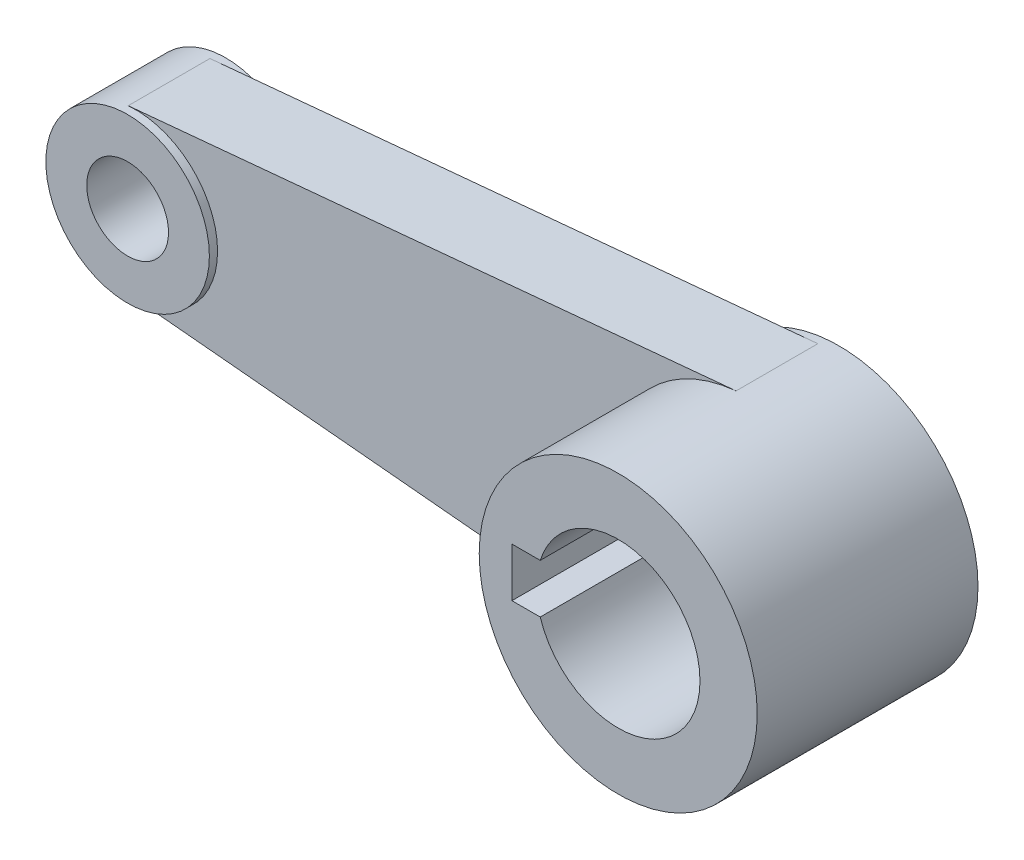
ISO-10303-21;
HEADER;
FILE_DESCRIPTION(('STEP AP214'),'2;1');
FILE_NAME('part.step','',(''),(''),'','','');
FILE_SCHEMA(('AUTOMOTIVE_DESIGN { 1 0 10303 214 1 1 1 1 }'));
ENDSEC;
DATA;
#1=APPLICATION_CONTEXT('core data for automotive mechanical design processes');
#2=APPLICATION_PROTOCOL_DEFINITION('international standard','automotive_design',2000,#1);
#3=PRODUCT_CONTEXT('',#1,'mechanical');
#4=PRODUCT('Part','Part','',(#3));
#5=PRODUCT_RELATED_PRODUCT_CATEGORY('part','',(#4));
#6=PRODUCT_DEFINITION_FORMATION('','',#4);
#7=PRODUCT_DEFINITION_CONTEXT('part definition',#1,'design');
#8=PRODUCT_DEFINITION('design','',#6,#7);
#9=PRODUCT_DEFINITION_SHAPE('','',#8);
#10=(LENGTH_UNIT() NAMED_UNIT(*) SI_UNIT(.MILLI.,.METRE.));
#11=(NAMED_UNIT(*) PLANE_ANGLE_UNIT() SI_UNIT($,.RADIAN.));
#12=(NAMED_UNIT(*) SI_UNIT($,.STERADIAN.) SOLID_ANGLE_UNIT());
#13=UNCERTAINTY_MEASURE_WITH_UNIT(LENGTH_MEASURE(1.E-05),#10,'distance_accuracy_value','');
#14=(GEOMETRIC_REPRESENTATION_CONTEXT(3) GLOBAL_UNCERTAINTY_ASSIGNED_CONTEXT((#13)) GLOBAL_UNIT_ASSIGNED_CONTEXT((#10,
#11,#12)) REPRESENTATION_CONTEXT('',''));
#15=CARTESIAN_POINT('',(0.,0.,0.));
#16=DIRECTION('',(0.,0.,1.));
#17=DIRECTION('',(1.,0.,0.));
#18=AXIS2_PLACEMENT_3D('',#15,#16,#17);
#19=CARTESIAN_POINT('',(-75.,0.,6.));
#20=DIRECTION('',(0.,0.,-1.));
#21=DIRECTION('',(-1.,0.,0.));
#22=AXIS2_PLACEMENT_3D('',#19,#20,#21);
#23=CYLINDRICAL_SURFACE('',#22,9.99999999999999);
#24=DIRECTION('',(0.,0.,-1.));
#25=VECTOR('',#24,1.);
#26=CARTESIAN_POINT('',(-75.9333333333333,-9.95634917471705,5.));
#27=LINE('',#26,#25);
#28=CARTESIAN_POINT('',(-75.9333333333333,-9.95634917471705,5.));
#29=VERTEX_POINT('',#28);
#30=CARTESIAN_POINT('',(-75.9333333333333,-9.95634917471705,-5.));
#31=VERTEX_POINT('',#30);
#32=EDGE_CURVE('E51',#29,#31,#27,.T.);
#33=ORIENTED_EDGE('',*,*,#32,.F.);
#34=CARTESIAN_POINT('',(-75.,0.,5.));
#35=DIRECTION('',(0.,0.,1.));
#36=DIRECTION('',(1.,0.,0.));
#37=AXIS2_PLACEMENT_3D('',#34,#35,#36);
#38=CIRCLE('',#37,9.99999999999999);
#39=CARTESIAN_POINT('',(-75.9333333333333,9.95634917471705,5.));
#40=VERTEX_POINT('',#39);
#41=EDGE_CURVE('E56',#29,#40,#38,.T.);
#42=ORIENTED_EDGE('',*,*,#41,.T.);
#43=DIRECTION('',(0.,0.,-1.));
#44=VECTOR('',#43,1.);
#45=CARTESIAN_POINT('',(-75.9333333333333,9.95634917471705,5.));
#46=LINE('',#45,#44);
#47=CARTESIAN_POINT('',(-75.9333333333333,9.95634917471705,-5.));
#48=VERTEX_POINT('',#47);
#49=EDGE_CURVE('E162',#40,#48,#46,.T.);
#50=ORIENTED_EDGE('',*,*,#49,.T.);
#51=CARTESIAN_POINT('',(-75.,0.,-5.));
#52=DIRECTION('',(0.,0.,1.));
#53=DIRECTION('',(1.,0.,0.));
#54=AXIS2_PLACEMENT_3D('',#51,#52,#53);
#55=CIRCLE('',#54,9.99999999999999);
#56=EDGE_CURVE('E148',#31,#48,#55,.T.);
#57=ORIENTED_EDGE('',*,*,#56,.F.);
#58=EDGE_LOOP('',(#33,#42,#50,#57));
#59=FACE_BOUND('',#58,.T.);
#60=CARTESIAN_POINT('',(-75.,0.,6.));
#61=DIRECTION('',(0.,0.,1.));
#62=DIRECTION('',(1.,0.,0.));
#63=AXIS2_PLACEMENT_3D('',#60,#61,#62);
#64=CIRCLE('',#63,9.99999999999999);
#65=CARTESIAN_POINT('',(-65.,0.,6.));
#66=VERTEX_POINT('',#65);
#67=EDGE_CURVE('E11',#66,#66,#64,.T.);
#68=ORIENTED_EDGE('',*,*,#67,.F.);
#69=EDGE_LOOP('',(#68));
#70=FACE_BOUND('',#69,.T.);
#71=CARTESIAN_POINT('',(-75.,0.,-6.));
#72=DIRECTION('',(0.,0.,1.));
#73=DIRECTION('',(1.,0.,0.));
#74=AXIS2_PLACEMENT_3D('',#71,#72,#73);
#75=CIRCLE('',#74,9.99999999999999);
#76=CARTESIAN_POINT('',(-65.,0.,-6.));
#77=VERTEX_POINT('',#76);
#78=EDGE_CURVE('E40',#77,#77,#75,.T.);
#79=ORIENTED_EDGE('',*,*,#78,.T.);
#80=EDGE_LOOP('',(#79));
#81=FACE_BOUND('',#80,.T.);
#82=ADVANCED_FACE('F37',(#59,#70,#81),#23,.T.);
#83=CARTESIAN_POINT('',(0.,0.,6.));
#84=DIRECTION('',(0.,0.,1.));
#85=DIRECTION('',(1.,0.,0.));
#86=AXIS2_PLACEMENT_3D('',#83,#84,#85);
#87=PLANE('',#86);
#88=CARTESIAN_POINT('',(-75.,0.,6.));
#89=DIRECTION('',(0.,0.,1.));
#90=DIRECTION('',(1.,0.,0.));
#91=AXIS2_PLACEMENT_3D('',#88,#89,#90);
#92=CIRCLE('',#91,5.);
#93=CARTESIAN_POINT('',(-70.,0.,6.));
#94=VERTEX_POINT('',#93);
#95=EDGE_CURVE('E379',#94,#94,#92,.T.);
#96=ORIENTED_EDGE('',*,*,#95,.F.);
#97=EDGE_LOOP('',(#96));
#98=FACE_BOUND('',#97,.T.);
#99=ORIENTED_EDGE('',*,*,#67,.T.);
#100=EDGE_LOOP('',(#99));
#101=FACE_BOUND('',#100,.T.);
#102=ADVANCED_FACE('F188',(#98,#101),#87,.T.);
#103=CARTESIAN_POINT('',(0.,0.,-6.));
#104=DIRECTION('',(0.,0.,1.));
#105=DIRECTION('',(1.,0.,0.));
#106=AXIS2_PLACEMENT_3D('',#103,#104,#105);
#107=PLANE('',#106);
#108=CARTESIAN_POINT('',(-75.,0.,-6.));
#109=DIRECTION('',(0.,0.,1.));
#110=DIRECTION('',(1.,0.,0.));
#111=AXIS2_PLACEMENT_3D('',#108,#109,#110);
#112=CIRCLE('',#111,5.);
#113=CARTESIAN_POINT('',(-70.,0.,-6.));
#114=VERTEX_POINT('',#113);
#115=EDGE_CURVE('E123',#114,#114,#112,.T.);
#116=ORIENTED_EDGE('',*,*,#115,.T.);
#117=EDGE_LOOP('',(#116));
#118=FACE_BOUND('',#117,.T.);
#119=ORIENTED_EDGE('',*,*,#78,.F.);
#120=EDGE_LOOP('',(#119));
#121=FACE_BOUND('',#120,.T.);
#122=ADVANCED_FACE('F185',(#118,#121),#107,.F.);
#123=CARTESIAN_POINT('',(-1.58666666666667,-16.925793597019,5.));
#124=DIRECTION('',(0.0933333333333334,0.995634917471705,0.));
#125=DIRECTION('',(-0.995634917471705,0.0933333333333334,0.));
#126=AXIS2_PLACEMENT_3D('',#123,#124,#125);
#127=PLANE('',#126);
#128=DIRECTION('',(0.995634917471705,-0.0933333333333334,0.));
#129=VECTOR('',#128,1.);
#130=CARTESIAN_POINT('',(-1.58666666666667,-16.925793597019,-5.));
#131=LINE('',#130,#129);
#132=CARTESIAN_POINT('',(-1.58666666666667,-16.925793597019,-5.));
#133=VERTEX_POINT('',#132);
#134=EDGE_CURVE('E165',#31,#133,#131,.T.);
#135=ORIENTED_EDGE('',*,*,#134,.T.);
#136=DIRECTION('',(0.,0.,-1.));
#137=VECTOR('',#136,1.);
#138=CARTESIAN_POINT('',(-1.58666666666667,-16.925793597019,5.));
#139=LINE('',#138,#137);
#140=CARTESIAN_POINT('',(-1.58666666666667,-16.925793597019,5.));
#141=VERTEX_POINT('',#140);
#142=EDGE_CURVE('E177',#141,#133,#139,.T.);
#143=ORIENTED_EDGE('',*,*,#142,.F.);
#144=DIRECTION('',(0.995634917471705,-0.0933333333333334,0.));
#145=VECTOR('',#144,1.);
#146=CARTESIAN_POINT('',(-1.58666666666667,-16.925793597019,5.));
#147=LINE('',#146,#145);
#148=EDGE_CURVE('E153',#29,#141,#147,.T.);
#149=ORIENTED_EDGE('',*,*,#148,.F.);
#150=ORIENTED_EDGE('',*,*,#32,.T.);
#151=EDGE_LOOP('',(#135,#143,#149,#150));
#152=FACE_BOUND('',#151,.T.);
#153=ADVANCED_FACE('F187',(#152),#127,.F.);
#154=CARTESIAN_POINT('',(-1.58666666666667,16.925793597019,5.));
#155=DIRECTION('',(-0.0933333333333334,0.995634917471705,0.));
#156=DIRECTION('',(-0.995634917471705,-0.0933333333333334,0.));
#157=AXIS2_PLACEMENT_3D('',#154,#155,#156);
#158=PLANE('',#157);
#159=DIRECTION('',(0.995634917471705,0.0933333333333334,0.));
#160=VECTOR('',#159,1.);
#161=CARTESIAN_POINT('',(-1.58666666666667,16.925793597019,-5.));
#162=LINE('',#161,#160);
#163=CARTESIAN_POINT('',(-1.58666666666667,16.925793597019,-5.));
#164=VERTEX_POINT('',#163);
#165=EDGE_CURVE('E154',#48,#164,#162,.T.);
#166=ORIENTED_EDGE('',*,*,#165,.F.);
#167=ORIENTED_EDGE('',*,*,#49,.F.);
#168=DIRECTION('',(0.995634917471705,0.0933333333333334,0.));
#169=VECTOR('',#168,1.);
#170=CARTESIAN_POINT('',(-1.58666666666667,16.925793597019,5.));
#171=LINE('',#170,#169);
#172=CARTESIAN_POINT('',(-1.58666666666667,16.925793597019,5.));
#173=VERTEX_POINT('',#172);
#174=EDGE_CURVE('E159',#40,#173,#171,.T.);
#175=ORIENTED_EDGE('',*,*,#174,.T.);
#176=DIRECTION('',(0.,0.,-1.));
#177=VECTOR('',#176,1.);
#178=CARTESIAN_POINT('',(-1.58666666666667,16.925793597019,5.));
#179=LINE('',#178,#177);
#180=EDGE_CURVE('E174',#173,#164,#179,.T.);
#181=ORIENTED_EDGE('',*,*,#180,.T.);
#182=EDGE_LOOP('',(#166,#167,#175,#181));
#183=FACE_BOUND('',#182,.T.);
#184=ADVANCED_FACE('F194',(#183),#158,.T.);
#185=CARTESIAN_POINT('',(0.,0.,5.));
#186=DIRECTION('',(0.,0.,1.));
#187=DIRECTION('',(1.,0.,0.));
#188=AXIS2_PLACEMENT_3D('',#185,#186,#187);
#189=PLANE('',#188);
#190=ORIENTED_EDGE('',*,*,#41,.F.);
#191=ORIENTED_EDGE('',*,*,#148,.T.);
#192=CARTESIAN_POINT('',(0.,0.,5.));
#193=DIRECTION('',(0.,0.,1.));
#194=DIRECTION('',(1.,0.,0.));
#195=AXIS2_PLACEMENT_3D('',#192,#193,#194);
#196=CIRCLE('',#195,17.);
#197=EDGE_CURVE('E157',#173,#141,#196,.T.);
#198=ORIENTED_EDGE('',*,*,#197,.F.);
#199=ORIENTED_EDGE('',*,*,#174,.F.);
#200=EDGE_LOOP('',(#190,#191,#198,#199));
#201=FACE_BOUND('',#200,.T.);
#202=ADVANCED_FACE('F288',(#201),#189,.T.);
#203=CARTESIAN_POINT('',(0.,0.,-5.));
#204=DIRECTION('',(0.,0.,1.));
#205=DIRECTION('',(1.,0.,0.));
#206=AXIS2_PLACEMENT_3D('',#203,#204,#205);
#207=PLANE('',#206);
#208=ORIENTED_EDGE('',*,*,#56,.T.);
#209=ORIENTED_EDGE('',*,*,#165,.T.);
#210=CARTESIAN_POINT('',(0.,0.,-5.));
#211=DIRECTION('',(0.,0.,1.));
#212=DIRECTION('',(1.,0.,0.));
#213=AXIS2_PLACEMENT_3D('',#210,#211,#212);
#214=CIRCLE('',#213,17.);
#215=EDGE_CURVE('E168',#164,#133,#214,.T.);
#216=ORIENTED_EDGE('',*,*,#215,.T.);
#217=ORIENTED_EDGE('',*,*,#134,.F.);
#218=EDGE_LOOP('',(#208,#209,#216,#217));
#219=FACE_BOUND('',#218,.T.);
#220=ADVANCED_FACE('F281',(#219),#207,.F.);
#221=CARTESIAN_POINT('',(0.,-3.,-6.));
#222=DIRECTION('',(0.,-1.,0.));
#223=DIRECTION('',(0.,0.,-1.));
#224=AXIS2_PLACEMENT_3D('',#221,#222,#223);
#225=PLANE('',#224);
#226=DIRECTION('',(0.,0.,1.));
#227=VECTOR('',#226,1.);
#228=CARTESIAN_POINT('',(-13.,-3.,-6.));
#229=LINE('',#228,#227);
#230=CARTESIAN_POINT('',(-13.,-3.,-6.));
#231=VERTEX_POINT('',#230);
#232=CARTESIAN_POINT('',(-13.,-3.,21.));
#233=VERTEX_POINT('',#232);
#234=EDGE_CURVE('E101',#231,#233,#229,.T.);
#235=ORIENTED_EDGE('',*,*,#234,.T.);
#236=DIRECTION('',(1.,0.,0.));
#237=VECTOR('',#236,1.);
#238=CARTESIAN_POINT('',(0.,-3.,21.));
#239=LINE('',#238,#237);
#240=CARTESIAN_POINT('',(-9.53939201416946,-3.,21.));
#241=VERTEX_POINT('',#240);
#242=EDGE_CURVE('E105',#233,#241,#239,.T.);
#243=ORIENTED_EDGE('',*,*,#242,.T.);
#244=DIRECTION('',(0.,0.,1.));
#245=VECTOR('',#244,1.);
#246=CARTESIAN_POINT('',(-9.53939201416946,-3.,-6.));
#247=LINE('',#246,#245);
#248=CARTESIAN_POINT('',(-9.53939201416946,-3.,-6.));
#249=VERTEX_POINT('',#248);
#250=EDGE_CURVE('E146',#249,#241,#247,.T.);
#251=ORIENTED_EDGE('',*,*,#250,.F.);
#252=DIRECTION('',(1.,0.,0.));
#253=VECTOR('',#252,1.);
#254=CARTESIAN_POINT('',(0.,-3.,-6.));
#255=LINE('',#254,#253);
#256=EDGE_CURVE('E108',#231,#249,#255,.T.);
#257=ORIENTED_EDGE('',*,*,#256,.F.);
#258=EDGE_LOOP('',(#235,#243,#251,#257));
#259=FACE_BOUND('',#258,.T.);
#260=ADVANCED_FACE('F103',(#259),#225,.F.);
#261=CARTESIAN_POINT('',(0.,0.,-6.));
#262=DIRECTION('',(0.,0.,1.));
#263=DIRECTION('',(1.,0.,0.));
#264=AXIS2_PLACEMENT_3D('',#261,#262,#263);
#265=CYLINDRICAL_SURFACE('',#264,10.);
#266=ORIENTED_EDGE('',*,*,#250,.T.);
#267=CARTESIAN_POINT('',(0.,0.,21.));
#268=DIRECTION('',(0.,0.,1.));
#269=DIRECTION('',(1.,0.,0.));
#270=AXIS2_PLACEMENT_3D('',#267,#268,#269);
#271=CIRCLE('',#270,10.);
#272=CARTESIAN_POINT('',(-9.53939201416946,3.,21.));
#273=VERTEX_POINT('',#272);
#274=EDGE_CURVE('E122',#241,#273,#271,.T.);
#275=ORIENTED_EDGE('',*,*,#274,.T.);
#276=DIRECTION('',(0.,0.,1.));
#277=VECTOR('',#276,1.);
#278=CARTESIAN_POINT('',(-9.53939201416946,3.,-6.));
#279=LINE('',#278,#277);
#280=CARTESIAN_POINT('',(-9.53939201416946,3.,-6.));
#281=VERTEX_POINT('',#280);
#282=EDGE_CURVE('E149',#281,#273,#279,.T.);
#283=ORIENTED_EDGE('',*,*,#282,.F.);
#284=CARTESIAN_POINT('',(0.,0.,-6.));
#285=DIRECTION('',(0.,0.,1.));
#286=DIRECTION('',(1.,0.,0.));
#287=AXIS2_PLACEMENT_3D('',#284,#285,#286);
#288=CIRCLE('',#287,10.);
#289=EDGE_CURVE('E142',#249,#281,#288,.T.);
#290=ORIENTED_EDGE('',*,*,#289,.F.);
#291=EDGE_LOOP('',(#266,#275,#283,#290));
#292=FACE_BOUND('',#291,.T.);
#293=ADVANCED_FACE('F266',(#292),#265,.F.);
#294=CARTESIAN_POINT('',(0.,3.,-6.));
#295=DIRECTION('',(0.,-1.,0.));
#296=DIRECTION('',(0.,0.,-1.));
#297=AXIS2_PLACEMENT_3D('',#294,#295,#296);
#298=PLANE('',#297);
#299=ORIENTED_EDGE('',*,*,#282,.T.);
#300=DIRECTION('',(1.,0.,0.));
#301=VECTOR('',#300,1.);
#302=CARTESIAN_POINT('',(0.,3.,21.));
#303=LINE('',#302,#301);
#304=CARTESIAN_POINT('',(-13.,3.,21.));
#305=VERTEX_POINT('',#304);
#306=EDGE_CURVE('E127',#305,#273,#303,.T.);
#307=ORIENTED_EDGE('',*,*,#306,.F.);
#308=DIRECTION('',(0.,0.,1.));
#309=VECTOR('',#308,1.);
#310=CARTESIAN_POINT('',(-13.,3.,-6.));
#311=LINE('',#310,#309);
#312=CARTESIAN_POINT('',(-13.,3.,-6.));
#313=VERTEX_POINT('',#312);
#314=EDGE_CURVE('E112',#313,#305,#311,.T.);
#315=ORIENTED_EDGE('',*,*,#314,.F.);
#316=DIRECTION('',(1.,0.,0.));
#317=VECTOR('',#316,1.);
#318=CARTESIAN_POINT('',(0.,3.,-6.));
#319=LINE('',#318,#317);
#320=EDGE_CURVE('E139',#313,#281,#319,.T.);
#321=ORIENTED_EDGE('',*,*,#320,.T.);
#322=EDGE_LOOP('',(#299,#307,#315,#321));
#323=FACE_BOUND('',#322,.T.);
#324=ADVANCED_FACE('F259',(#323),#298,.T.);
#325=CARTESIAN_POINT('',(-13.,0.,-6.));
#326=DIRECTION('',(-1.,0.,0.));
#327=DIRECTION('',(0.,0.,1.));
#328=AXIS2_PLACEMENT_3D('',#325,#326,#327);
#329=PLANE('',#328);
#330=ORIENTED_EDGE('',*,*,#314,.T.);
#331=DIRECTION('',(0.,-1.,0.));
#332=VECTOR('',#331,1.);
#333=CARTESIAN_POINT('',(-13.,0.,21.));
#334=LINE('',#333,#332);
#335=EDGE_CURVE('E120',#305,#233,#334,.T.);
#336=ORIENTED_EDGE('',*,*,#335,.T.);
#337=ORIENTED_EDGE('',*,*,#234,.F.);
#338=DIRECTION('',(0.,-1.,0.));
#339=VECTOR('',#338,1.);
#340=CARTESIAN_POINT('',(-13.,0.,-6.));
#341=LINE('',#340,#339);
#342=EDGE_CURVE('E137',#313,#231,#341,.T.);
#343=ORIENTED_EDGE('',*,*,#342,.F.);
#344=EDGE_LOOP('',(#330,#336,#337,#343));
#345=FACE_BOUND('',#344,.T.);
#346=ADVANCED_FACE('F125',(#345),#329,.F.);
#347=CARTESIAN_POINT('',(0.,0.,-6.));
#348=DIRECTION('',(0.,0.,1.));
#349=DIRECTION('',(1.,0.,0.));
#350=AXIS2_PLACEMENT_3D('',#347,#348,#349);
#351=CYLINDRICAL_SURFACE('',#350,17.);
#352=ORIENTED_EDGE('',*,*,#180,.F.);
#353=ORIENTED_EDGE('',*,*,#197,.T.);
#354=ORIENTED_EDGE('',*,*,#142,.T.);
#355=ORIENTED_EDGE('',*,*,#215,.F.);
#356=EDGE_LOOP('',(#352,#353,#354,#355));
#357=FACE_BOUND('',#356,.T.);
#358=CARTESIAN_POINT('',(0.,0.,-6.));
#359=DIRECTION('',(0.,0.,1.));
#360=DIRECTION('',(1.,0.,0.));
#361=AXIS2_PLACEMENT_3D('',#358,#359,#360);
#362=CIRCLE('',#361,17.);
#363=CARTESIAN_POINT('',(17.,0.,-6.));
#364=VERTEX_POINT('',#363);
#365=EDGE_CURVE('E113',#364,#364,#362,.T.);
#366=ORIENTED_EDGE('',*,*,#365,.T.);
#367=EDGE_LOOP('',(#366));
#368=FACE_BOUND('',#367,.T.);
#369=CARTESIAN_POINT('',(0.,0.,21.));
#370=DIRECTION('',(0.,0.,1.));
#371=DIRECTION('',(1.,0.,0.));
#372=AXIS2_PLACEMENT_3D('',#369,#370,#371);
#373=CIRCLE('',#372,17.);
#374=CARTESIAN_POINT('',(17.,0.,21.));
#375=VERTEX_POINT('',#374);
#376=EDGE_CURVE('E133',#375,#375,#373,.T.);
#377=ORIENTED_EDGE('',*,*,#376,.F.);
#378=EDGE_LOOP('',(#377));
#379=FACE_BOUND('',#378,.T.);
#380=ADVANCED_FACE('F244',(#357,#368,#379),#351,.T.);
#381=CARTESIAN_POINT('',(0.,0.,-6.));
#382=DIRECTION('',(0.,0.,1.));
#383=DIRECTION('',(1.,0.,0.));
#384=AXIS2_PLACEMENT_3D('',#381,#382,#383);
#385=PLANE('',#384);
#386=ORIENTED_EDGE('',*,*,#256,.T.);
#387=ORIENTED_EDGE('',*,*,#289,.T.);
#388=ORIENTED_EDGE('',*,*,#320,.F.);
#389=ORIENTED_EDGE('',*,*,#342,.T.);
#390=EDGE_LOOP('',(#386,#387,#388,#389));
#391=FACE_BOUND('',#390,.T.);
#392=ORIENTED_EDGE('',*,*,#365,.F.);
#393=EDGE_LOOP('',(#392));
#394=FACE_BOUND('',#393,.T.);
#395=ADVANCED_FACE('F240',(#391,#394),#385,.F.);
#396=CARTESIAN_POINT('',(0.,0.,21.));
#397=DIRECTION('',(0.,0.,1.));
#398=DIRECTION('',(1.,0.,0.));
#399=AXIS2_PLACEMENT_3D('',#396,#397,#398);
#400=PLANE('',#399);
#401=ORIENTED_EDGE('',*,*,#242,.F.);
#402=ORIENTED_EDGE('',*,*,#335,.F.);
#403=ORIENTED_EDGE('',*,*,#306,.T.);
#404=ORIENTED_EDGE('',*,*,#274,.F.);
#405=EDGE_LOOP('',(#401,#402,#403,#404));
#406=FACE_BOUND('',#405,.T.);
#407=ORIENTED_EDGE('',*,*,#376,.T.);
#408=EDGE_LOOP('',(#407));
#409=FACE_BOUND('',#408,.T.);
#410=ADVANCED_FACE('F117',(#406,#409),#400,.T.);
#411=CARTESIAN_POINT('',(-75.,0.,6.));
#412=DIRECTION('',(0.,0.,1.));
#413=DIRECTION('',(1.,0.,0.));
#414=AXIS2_PLACEMENT_3D('',#411,#412,#413);
#415=CYLINDRICAL_SURFACE('',#414,5.);
#416=ORIENTED_EDGE('',*,*,#115,.F.);
#417=EDGE_LOOP('',(#416));
#418=FACE_BOUND('',#417,.T.);
#419=ORIENTED_EDGE('',*,*,#95,.T.);
#420=EDGE_LOOP('',(#419));
#421=FACE_BOUND('',#420,.T.);
#422=ADVANCED_FACE('F227',(#418,#421),#415,.F.);
#423=CLOSED_SHELL('',(#82,#102,#122,#153,#184,#202,#220,#260,#293,#324,#346,#380,#395,#410,#422));
#424=MANIFOLD_SOLID_BREP('B2',#423);
#425=ADVANCED_BREP_SHAPE_REPRESENTATION('',(#18,#424),#14);
#426=SHAPE_DEFINITION_REPRESENTATION(#9,#425);
ENDSEC;
END-ISO-10303-21;
